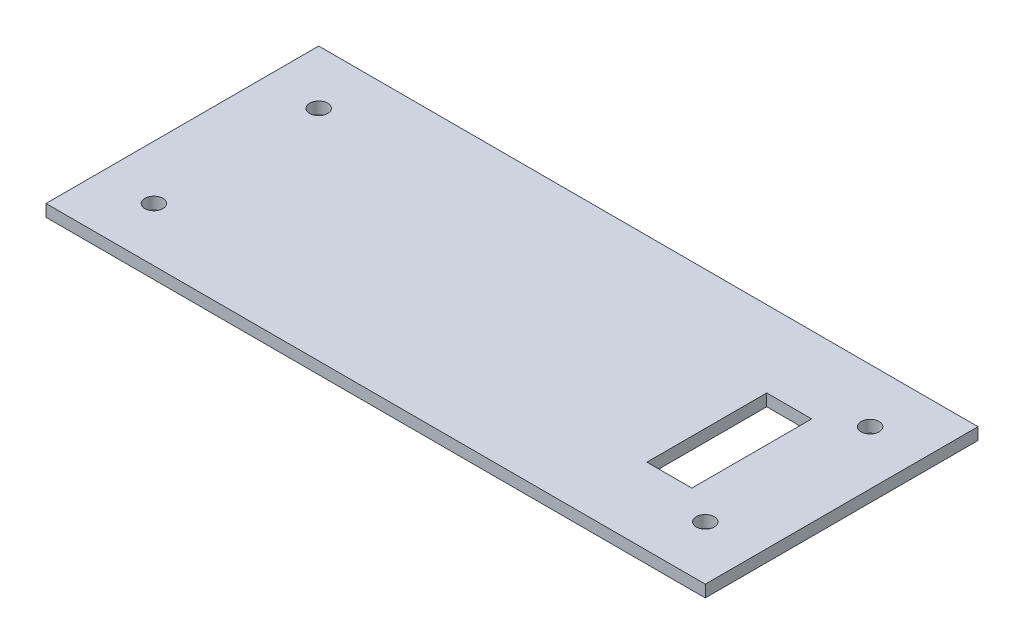
ISO-10303-21;
HEADER;
FILE_DESCRIPTION(('STEP AP214'),'2;1');
FILE_NAME('part.step','',(''),(''),'','','');
FILE_SCHEMA(('AUTOMOTIVE_DESIGN { 1 0 10303 214 1 1 1 1 }'));
ENDSEC;
DATA;
#1=APPLICATION_CONTEXT('core data for automotive mechanical design processes');
#2=APPLICATION_PROTOCOL_DEFINITION('international standard','automotive_design',2000,#1);
#3=PRODUCT_CONTEXT('',#1,'mechanical');
#4=PRODUCT('Part','Part','',(#3));
#5=PRODUCT_RELATED_PRODUCT_CATEGORY('part','',(#4));
#6=PRODUCT_DEFINITION_FORMATION('','',#4);
#7=PRODUCT_DEFINITION_CONTEXT('part definition',#1,'design');
#8=PRODUCT_DEFINITION('design','',#6,#7);
#9=PRODUCT_DEFINITION_SHAPE('','',#8);
#10=(LENGTH_UNIT() NAMED_UNIT(*) SI_UNIT(.MILLI.,.METRE.));
#11=(NAMED_UNIT(*) PLANE_ANGLE_UNIT() SI_UNIT($,.RADIAN.));
#12=(NAMED_UNIT(*) SI_UNIT($,.STERADIAN.) SOLID_ANGLE_UNIT());
#13=UNCERTAINTY_MEASURE_WITH_UNIT(LENGTH_MEASURE(1.E-05),#10,'distance_accuracy_value','');
#14=(GEOMETRIC_REPRESENTATION_CONTEXT(3) GLOBAL_UNCERTAINTY_ASSIGNED_CONTEXT((#13)) GLOBAL_UNIT_ASSIGNED_CONTEXT((#10,
#11,#12)) REPRESENTATION_CONTEXT('',''));
#15=CARTESIAN_POINT('',(0.,0.,0.));
#16=DIRECTION('',(0.,0.,1.));
#17=DIRECTION('',(1.,0.,0.));
#18=AXIS2_PLACEMENT_3D('',#15,#16,#17);
#19=CARTESIAN_POINT('',(55.,2.,-22.75));
#20=DIRECTION('',(-1.,0.,0.));
#21=DIRECTION('',(0.,0.,1.));
#22=AXIS2_PLACEMENT_3D('',#19,#20,#21);
#23=PLANE('',#22);
#24=DIRECTION('',(0.,0.,-1.));
#25=VECTOR('',#24,1.);
#26=CARTESIAN_POINT('',(55.,0.,-22.75));
#27=LINE('',#26,#25);
#28=CARTESIAN_POINT('',(55.,0.,22.75));
#29=VERTEX_POINT('',#28);
#30=CARTESIAN_POINT('',(55.,0.,-22.75));
#31=VERTEX_POINT('',#30);
#32=EDGE_CURVE('E140',#29,#31,#27,.T.);
#33=ORIENTED_EDGE('',*,*,#32,.T.);
#34=DIRECTION('',(0.,-1.,0.));
#35=VECTOR('',#34,1.);
#36=CARTESIAN_POINT('',(55.,2.,-22.75));
#37=LINE('',#36,#35);
#38=CARTESIAN_POINT('',(55.,2.,-22.75));
#39=VERTEX_POINT('',#38);
#40=EDGE_CURVE('E11',#39,#31,#37,.T.);
#41=ORIENTED_EDGE('',*,*,#40,.F.);
#42=DIRECTION('',(0.,0.,-1.));
#43=VECTOR('',#42,1.);
#44=CARTESIAN_POINT('',(55.,2.,-22.75));
#45=LINE('',#44,#43);
#46=CARTESIAN_POINT('',(55.,2.,22.75));
#47=VERTEX_POINT('',#46);
#48=EDGE_CURVE('E141',#47,#39,#45,.T.);
#49=ORIENTED_EDGE('',*,*,#48,.F.);
#50=DIRECTION('',(0.,-1.,0.));
#51=VECTOR('',#50,1.);
#52=CARTESIAN_POINT('',(55.,2.,22.75));
#53=LINE('',#52,#51);
#54=EDGE_CURVE('E151',#47,#29,#53,.T.);
#55=ORIENTED_EDGE('',*,*,#54,.T.);
#56=EDGE_LOOP('',(#33,#41,#49,#55));
#57=FACE_BOUND('',#56,.T.);
#58=ADVANCED_FACE('F32',(#57),#23,.F.);
#59=CARTESIAN_POINT('',(-55.,2.,-22.75));
#60=DIRECTION('',(0.,0.,1.));
#61=DIRECTION('',(1.,0.,0.));
#62=AXIS2_PLACEMENT_3D('',#59,#60,#61);
#63=PLANE('',#62);
#64=DIRECTION('',(-1.,0.,0.));
#65=VECTOR('',#64,1.);
#66=CARTESIAN_POINT('',(-55.,0.,-22.75));
#67=LINE('',#66,#65);
#68=CARTESIAN_POINT('',(-55.,0.,-22.75));
#69=VERTEX_POINT('',#68);
#70=EDGE_CURVE('E154',#31,#69,#67,.T.);
#71=ORIENTED_EDGE('',*,*,#70,.T.);
#72=DIRECTION('',(0.,-1.,0.));
#73=VECTOR('',#72,1.);
#74=CARTESIAN_POINT('',(-55.,2.,-22.75));
#75=LINE('',#74,#73);
#76=CARTESIAN_POINT('',(-55.,2.,-22.75));
#77=VERTEX_POINT('',#76);
#78=EDGE_CURVE('E39',#77,#69,#75,.T.);
#79=ORIENTED_EDGE('',*,*,#78,.F.);
#80=DIRECTION('',(-1.,0.,0.));
#81=VECTOR('',#80,1.);
#82=CARTESIAN_POINT('',(-55.,2.,-22.75));
#83=LINE('',#82,#81);
#84=EDGE_CURVE('E144',#39,#77,#83,.T.);
#85=ORIENTED_EDGE('',*,*,#84,.F.);
#86=ORIENTED_EDGE('',*,*,#40,.T.);
#87=EDGE_LOOP('',(#71,#79,#85,#86));
#88=FACE_BOUND('',#87,.T.);
#89=ADVANCED_FACE('F183',(#88),#63,.F.);
#90=CARTESIAN_POINT('',(-55.,2.,-22.75));
#91=DIRECTION('',(1.,0.,0.));
#92=DIRECTION('',(0.,0.,-1.));
#93=AXIS2_PLACEMENT_3D('',#90,#91,#92);
#94=PLANE('',#93);
#95=DIRECTION('',(0.,0.,1.));
#96=VECTOR('',#95,1.);
#97=CARTESIAN_POINT('',(-55.,0.,-22.75));
#98=LINE('',#97,#96);
#99=CARTESIAN_POINT('',(-55.,0.,22.75));
#100=VERTEX_POINT('',#99);
#101=EDGE_CURVE('E156',#69,#100,#98,.T.);
#102=ORIENTED_EDGE('',*,*,#101,.T.);
#103=DIRECTION('',(0.,-1.,0.));
#104=VECTOR('',#103,1.);
#105=CARTESIAN_POINT('',(-55.,2.,22.75));
#106=LINE('',#105,#104);
#107=CARTESIAN_POINT('',(-55.,2.,22.75));
#108=VERTEX_POINT('',#107);
#109=EDGE_CURVE('E161',#108,#100,#106,.T.);
#110=ORIENTED_EDGE('',*,*,#109,.F.);
#111=DIRECTION('',(0.,0.,1.));
#112=VECTOR('',#111,1.);
#113=CARTESIAN_POINT('',(-55.,2.,-22.75));
#114=LINE('',#113,#112);
#115=EDGE_CURVE('E147',#77,#108,#114,.T.);
#116=ORIENTED_EDGE('',*,*,#115,.F.);
#117=ORIENTED_EDGE('',*,*,#78,.T.);
#118=EDGE_LOOP('',(#102,#110,#116,#117));
#119=FACE_BOUND('',#118,.T.);
#120=ADVANCED_FACE('F168',(#119),#94,.F.);
#121=CARTESIAN_POINT('',(-55.,2.,22.75));
#122=DIRECTION('',(0.,0.,-1.));
#123=DIRECTION('',(-1.,0.,0.));
#124=AXIS2_PLACEMENT_3D('',#121,#122,#123);
#125=PLANE('',#124);
#126=DIRECTION('',(1.,0.,0.));
#127=VECTOR('',#126,1.);
#128=CARTESIAN_POINT('',(-55.,0.,22.75));
#129=LINE('',#128,#127);
#130=EDGE_CURVE('E145',#100,#29,#129,.T.);
#131=ORIENTED_EDGE('',*,*,#130,.T.);
#132=ORIENTED_EDGE('',*,*,#54,.F.);
#133=DIRECTION('',(1.,0.,0.));
#134=VECTOR('',#133,1.);
#135=CARTESIAN_POINT('',(-55.,2.,22.75));
#136=LINE('',#135,#134);
#137=EDGE_CURVE('E149',#108,#47,#136,.T.);
#138=ORIENTED_EDGE('',*,*,#137,.F.);
#139=ORIENTED_EDGE('',*,*,#109,.T.);
#140=EDGE_LOOP('',(#131,#132,#138,#139));
#141=FACE_BOUND('',#140,.T.);
#142=ADVANCED_FACE('F176',(#141),#125,.F.);
#143=CARTESIAN_POINT('',(0.,2.,0.));
#144=DIRECTION('',(0.,1.,0.));
#145=DIRECTION('',(0.,0.,1.));
#146=AXIS2_PLACEMENT_3D('',#143,#144,#145);
#147=PLANE('',#146);
#148=DIRECTION('',(0.,0.,-1.));
#149=VECTOR('',#148,1.);
#150=CARTESIAN_POINT('',(40.,2.,10.));
#151=LINE('',#150,#149);
#152=CARTESIAN_POINT('',(40.,2.,10.));
#153=VERTEX_POINT('',#152);
#154=CARTESIAN_POINT('',(40.,2.,-10.));
#155=VERTEX_POINT('',#154);
#156=EDGE_CURVE('E46',#153,#155,#151,.T.);
#157=ORIENTED_EDGE('',*,*,#156,.F.);
#158=DIRECTION('',(1.,0.,0.));
#159=VECTOR('',#158,1.);
#160=CARTESIAN_POINT('',(32.5,2.,10.));
#161=LINE('',#160,#159);
#162=CARTESIAN_POINT('',(32.5,2.,10.));
#163=VERTEX_POINT('',#162);
#164=EDGE_CURVE('E104',#163,#153,#161,.T.);
#165=ORIENTED_EDGE('',*,*,#164,.F.);
#166=DIRECTION('',(0.,0.,1.));
#167=VECTOR('',#166,1.);
#168=CARTESIAN_POINT('',(32.5,2.,10.));
#169=LINE('',#168,#167);
#170=CARTESIAN_POINT('',(32.5,2.,-10.));
#171=VERTEX_POINT('',#170);
#172=EDGE_CURVE('E124',#171,#163,#169,.T.);
#173=ORIENTED_EDGE('',*,*,#172,.F.);
#174=DIRECTION('',(-1.,0.,0.));
#175=VECTOR('',#174,1.);
#176=CARTESIAN_POINT('',(32.5,2.,-10.));
#177=LINE('',#176,#175);
#178=EDGE_CURVE('E118',#155,#171,#177,.T.);
#179=ORIENTED_EDGE('',*,*,#178,.F.);
#180=EDGE_LOOP('',(#157,#165,#173,#179));
#181=FACE_BOUND('',#180,.T.);
#182=CARTESIAN_POINT('',(46.,2.,13.75));
#183=DIRECTION('',(0.,1.,0.));
#184=DIRECTION('',(0.,0.,-1.));
#185=AXIS2_PLACEMENT_3D('',#182,#183,#184);
#186=CIRCLE('',#185,1.5);
#187=CARTESIAN_POINT('',(46.,2.,12.25));
#188=VERTEX_POINT('',#187);
#189=EDGE_CURVE('E110',#188,#188,#186,.T.);
#190=ORIENTED_EDGE('',*,*,#189,.F.);
#191=EDGE_LOOP('',(#190));
#192=FACE_BOUND('',#191,.T.);
#193=CARTESIAN_POINT('',(46.,2.,-13.75));
#194=DIRECTION('',(0.,1.,0.));
#195=DIRECTION('',(0.,0.,1.));
#196=AXIS2_PLACEMENT_3D('',#193,#194,#195);
#197=CIRCLE('',#196,1.5);
#198=CARTESIAN_POINT('',(46.,2.,-12.25));
#199=VERTEX_POINT('',#198);
#200=EDGE_CURVE('E237',#199,#199,#197,.T.);
#201=ORIENTED_EDGE('',*,*,#200,.F.);
#202=EDGE_LOOP('',(#201));
#203=FACE_BOUND('',#202,.T.);
#204=CARTESIAN_POINT('',(-46.,2.,-13.75));
#205=DIRECTION('',(0.,1.,0.));
#206=DIRECTION('',(0.,0.,-1.));
#207=AXIS2_PLACEMENT_3D('',#204,#205,#206);
#208=CIRCLE('',#207,1.5);
#209=CARTESIAN_POINT('',(-46.,2.,-15.25));
#210=VERTEX_POINT('',#209);
#211=EDGE_CURVE('E229',#210,#210,#208,.T.);
#212=ORIENTED_EDGE('',*,*,#211,.F.);
#213=EDGE_LOOP('',(#212));
#214=FACE_BOUND('',#213,.T.);
#215=CARTESIAN_POINT('',(-46.,2.,13.75));
#216=DIRECTION('',(0.,1.,0.));
#217=DIRECTION('',(0.,0.,1.));
#218=AXIS2_PLACEMENT_3D('',#215,#216,#217);
#219=CIRCLE('',#218,1.5);
#220=CARTESIAN_POINT('',(-46.,2.,15.25));
#221=VERTEX_POINT('',#220);
#222=EDGE_CURVE('E133',#221,#221,#219,.T.);
#223=ORIENTED_EDGE('',*,*,#222,.F.);
#224=EDGE_LOOP('',(#223));
#225=FACE_BOUND('',#224,.T.);
#226=ORIENTED_EDGE('',*,*,#48,.T.);
#227=ORIENTED_EDGE('',*,*,#84,.T.);
#228=ORIENTED_EDGE('',*,*,#115,.T.);
#229=ORIENTED_EDGE('',*,*,#137,.T.);
#230=EDGE_LOOP('',(#226,#227,#228,#229));
#231=FACE_BOUND('',#230,.T.);
#232=ADVANCED_FACE('F182',(#181,#192,#203,#214,#225,#231),#147,.T.);
#233=CARTESIAN_POINT('',(0.,0.,0.));
#234=DIRECTION('',(0.,1.,0.));
#235=DIRECTION('',(0.,0.,1.));
#236=AXIS2_PLACEMENT_3D('',#233,#234,#235);
#237=PLANE('',#236);
#238=DIRECTION('',(-1.,0.,0.));
#239=VECTOR('',#238,1.);
#240=CARTESIAN_POINT('',(32.5,0.,10.));
#241=LINE('',#240,#239);
#242=CARTESIAN_POINT('',(40.,0.,10.));
#243=VERTEX_POINT('',#242);
#244=CARTESIAN_POINT('',(32.5,0.,10.));
#245=VERTEX_POINT('',#244);
#246=EDGE_CURVE('E116',#243,#245,#241,.T.);
#247=ORIENTED_EDGE('',*,*,#246,.F.);
#248=DIRECTION('',(0.,0.,1.));
#249=VECTOR('',#248,1.);
#250=CARTESIAN_POINT('',(40.,0.,10.));
#251=LINE('',#250,#249);
#252=CARTESIAN_POINT('',(40.,0.,-10.));
#253=VERTEX_POINT('',#252);
#254=EDGE_CURVE('E98',#253,#243,#251,.T.);
#255=ORIENTED_EDGE('',*,*,#254,.F.);
#256=DIRECTION('',(1.,0.,0.));
#257=VECTOR('',#256,1.);
#258=CARTESIAN_POINT('',(32.5,0.,-10.));
#259=LINE('',#258,#257);
#260=CARTESIAN_POINT('',(32.5,0.,-10.));
#261=VERTEX_POINT('',#260);
#262=EDGE_CURVE('E107',#261,#253,#259,.T.);
#263=ORIENTED_EDGE('',*,*,#262,.F.);
#264=DIRECTION('',(0.,0.,-1.));
#265=VECTOR('',#264,1.);
#266=CARTESIAN_POINT('',(32.5,0.,10.));
#267=LINE('',#266,#265);
#268=EDGE_CURVE('E54',#245,#261,#267,.T.);
#269=ORIENTED_EDGE('',*,*,#268,.F.);
#270=EDGE_LOOP('',(#247,#255,#263,#269));
#271=FACE_BOUND('',#270,.T.);
#272=CARTESIAN_POINT('',(46.,0.,13.75));
#273=DIRECTION('',(0.,1.,0.));
#274=DIRECTION('',(0.,0.,1.));
#275=AXIS2_PLACEMENT_3D('',#272,#273,#274);
#276=CIRCLE('',#275,1.5);
#277=CARTESIAN_POINT('',(46.,0.,15.25));
#278=VERTEX_POINT('',#277);
#279=EDGE_CURVE('E240',#278,#278,#276,.F.);
#280=ORIENTED_EDGE('',*,*,#279,.F.);
#281=EDGE_LOOP('',(#280));
#282=FACE_BOUND('',#281,.T.);
#283=CARTESIAN_POINT('',(46.,0.,-13.75));
#284=DIRECTION('',(0.,1.,0.));
#285=DIRECTION('',(0.,0.,1.));
#286=AXIS2_PLACEMENT_3D('',#283,#284,#285);
#287=CIRCLE('',#286,1.5);
#288=CARTESIAN_POINT('',(46.,0.,-12.25));
#289=VERTEX_POINT('',#288);
#290=EDGE_CURVE('E234',#289,#289,#287,.F.);
#291=ORIENTED_EDGE('',*,*,#290,.F.);
#292=EDGE_LOOP('',(#291));
#293=FACE_BOUND('',#292,.T.);
#294=CARTESIAN_POINT('',(-46.,0.,-13.75));
#295=DIRECTION('',(0.,1.,0.));
#296=DIRECTION('',(0.,0.,1.));
#297=AXIS2_PLACEMENT_3D('',#294,#295,#296);
#298=CIRCLE('',#297,1.5);
#299=CARTESIAN_POINT('',(-46.,0.,-12.25));
#300=VERTEX_POINT('',#299);
#301=EDGE_CURVE('E137',#300,#300,#298,.F.);
#302=ORIENTED_EDGE('',*,*,#301,.F.);
#303=EDGE_LOOP('',(#302));
#304=FACE_BOUND('',#303,.T.);
#305=CARTESIAN_POINT('',(-46.,0.,13.75));
#306=DIRECTION('',(0.,1.,0.));
#307=DIRECTION('',(0.,0.,1.));
#308=AXIS2_PLACEMENT_3D('',#305,#306,#307);
#309=CIRCLE('',#308,1.5);
#310=CARTESIAN_POINT('',(-46.,0.,15.25));
#311=VERTEX_POINT('',#310);
#312=EDGE_CURVE('E136',#311,#311,#309,.F.);
#313=ORIENTED_EDGE('',*,*,#312,.F.);
#314=EDGE_LOOP('',(#313));
#315=FACE_BOUND('',#314,.T.);
#316=ORIENTED_EDGE('',*,*,#32,.F.);
#317=ORIENTED_EDGE('',*,*,#130,.F.);
#318=ORIENTED_EDGE('',*,*,#101,.F.);
#319=ORIENTED_EDGE('',*,*,#70,.F.);
#320=EDGE_LOOP('',(#316,#317,#318,#319));
#321=FACE_BOUND('',#320,.T.);
#322=ADVANCED_FACE('F113',(#271,#282,#293,#304,#315,#321),#237,.F.);
#323=CARTESIAN_POINT('',(-46.,-0.00100000000000013,13.75));
#324=DIRECTION('',(0.,1.,0.));
#325=DIRECTION('',(0.,0.,1.));
#326=AXIS2_PLACEMENT_3D('',#323,#324,#325);
#327=CYLINDRICAL_SURFACE('',#326,1.5);
#328=ORIENTED_EDGE('',*,*,#222,.T.);
#329=EDGE_LOOP('',(#328));
#330=FACE_BOUND('',#329,.T.);
#331=ORIENTED_EDGE('',*,*,#312,.T.);
#332=EDGE_LOOP('',(#331));
#333=FACE_BOUND('',#332,.T.);
#334=ADVANCED_FACE('F195',(#330,#333),#327,.F.);
#335=CARTESIAN_POINT('',(-46.,-0.00100000000000013,-13.75));
#336=DIRECTION('',(0.,1.,0.));
#337=DIRECTION('',(0.,0.,1.));
#338=AXIS2_PLACEMENT_3D('',#335,#336,#337);
#339=CYLINDRICAL_SURFACE('',#338,1.5);
#340=ORIENTED_EDGE('',*,*,#211,.T.);
#341=EDGE_LOOP('',(#340));
#342=FACE_BOUND('',#341,.T.);
#343=ORIENTED_EDGE('',*,*,#301,.T.);
#344=EDGE_LOOP('',(#343));
#345=FACE_BOUND('',#344,.T.);
#346=ADVANCED_FACE('F201',(#342,#345),#339,.F.);
#347=CARTESIAN_POINT('',(46.,-0.00100000000000013,-13.75));
#348=DIRECTION('',(0.,1.,0.));
#349=DIRECTION('',(0.,0.,1.));
#350=AXIS2_PLACEMENT_3D('',#347,#348,#349);
#351=CYLINDRICAL_SURFACE('',#350,1.5);
#352=ORIENTED_EDGE('',*,*,#200,.T.);
#353=EDGE_LOOP('',(#352));
#354=FACE_BOUND('',#353,.T.);
#355=ORIENTED_EDGE('',*,*,#290,.T.);
#356=EDGE_LOOP('',(#355));
#357=FACE_BOUND('',#356,.T.);
#358=ADVANCED_FACE('F217',(#354,#357),#351,.F.);
#359=CARTESIAN_POINT('',(46.,-0.00100000000000013,13.75));
#360=DIRECTION('',(0.,1.,0.));
#361=DIRECTION('',(0.,0.,1.));
#362=AXIS2_PLACEMENT_3D('',#359,#360,#361);
#363=CYLINDRICAL_SURFACE('',#362,1.5);
#364=ORIENTED_EDGE('',*,*,#189,.T.);
#365=EDGE_LOOP('',(#364));
#366=FACE_BOUND('',#365,.T.);
#367=ORIENTED_EDGE('',*,*,#279,.T.);
#368=EDGE_LOOP('',(#367));
#369=FACE_BOUND('',#368,.T.);
#370=ADVANCED_FACE('F206',(#366,#369),#363,.F.);
#371=CARTESIAN_POINT('',(40.,-0.00100000000000013,10.));
#372=DIRECTION('',(1.,0.,0.));
#373=DIRECTION('',(0.,0.,-1.));
#374=AXIS2_PLACEMENT_3D('',#371,#372,#373);
#375=PLANE('',#374);
#376=ORIENTED_EDGE('',*,*,#254,.T.);
#377=DIRECTION('',(0.,1.,0.));
#378=VECTOR('',#377,1.);
#379=CARTESIAN_POINT('',(40.,-0.00100000000000013,10.));
#380=LINE('',#379,#378);
#381=EDGE_CURVE('E111',#243,#153,#380,.T.);
#382=ORIENTED_EDGE('',*,*,#381,.T.);
#383=ORIENTED_EDGE('',*,*,#156,.T.);
#384=DIRECTION('',(0.,1.,0.));
#385=VECTOR('',#384,1.);
#386=CARTESIAN_POINT('',(40.,-0.00100000000000013,-10.));
#387=LINE('',#386,#385);
#388=EDGE_CURVE('E94',#253,#155,#387,.T.);
#389=ORIENTED_EDGE('',*,*,#388,.F.);
#390=EDGE_LOOP('',(#376,#382,#383,#389));
#391=FACE_BOUND('',#390,.T.);
#392=ADVANCED_FACE('F96',(#391),#375,.F.);
#393=CARTESIAN_POINT('',(32.5,-0.00100000000000013,10.));
#394=DIRECTION('',(0.,0.,1.));
#395=DIRECTION('',(1.,0.,0.));
#396=AXIS2_PLACEMENT_3D('',#393,#394,#395);
#397=PLANE('',#396);
#398=ORIENTED_EDGE('',*,*,#246,.T.);
#399=DIRECTION('',(0.,1.,0.));
#400=VECTOR('',#399,1.);
#401=CARTESIAN_POINT('',(32.5,-0.00100000000000013,10.));
#402=LINE('',#401,#400);
#403=EDGE_CURVE('E130',#245,#163,#402,.T.);
#404=ORIENTED_EDGE('',*,*,#403,.T.);
#405=ORIENTED_EDGE('',*,*,#164,.T.);
#406=ORIENTED_EDGE('',*,*,#381,.F.);
#407=EDGE_LOOP('',(#398,#404,#405,#406));
#408=FACE_BOUND('',#407,.T.);
#409=ADVANCED_FACE('F205',(#408),#397,.F.);
#410=CARTESIAN_POINT('',(32.5,-0.00100000000000013,10.));
#411=DIRECTION('',(-1.,0.,0.));
#412=DIRECTION('',(0.,0.,1.));
#413=AXIS2_PLACEMENT_3D('',#410,#411,#412);
#414=PLANE('',#413);
#415=ORIENTED_EDGE('',*,*,#268,.T.);
#416=DIRECTION('',(0.,1.,0.));
#417=VECTOR('',#416,1.);
#418=CARTESIAN_POINT('',(32.5,-0.00100000000000013,-10.));
#419=LINE('',#418,#417);
#420=EDGE_CURVE('E103',#261,#171,#419,.T.);
#421=ORIENTED_EDGE('',*,*,#420,.T.);
#422=ORIENTED_EDGE('',*,*,#172,.T.);
#423=ORIENTED_EDGE('',*,*,#403,.F.);
#424=EDGE_LOOP('',(#415,#421,#422,#423));
#425=FACE_BOUND('',#424,.T.);
#426=ADVANCED_FACE('F209',(#425),#414,.F.);
#427=CARTESIAN_POINT('',(32.5,-0.00100000000000013,-10.));
#428=DIRECTION('',(0.,0.,-1.));
#429=DIRECTION('',(-1.,0.,0.));
#430=AXIS2_PLACEMENT_3D('',#427,#428,#429);
#431=PLANE('',#430);
#432=ORIENTED_EDGE('',*,*,#262,.T.);
#433=ORIENTED_EDGE('',*,*,#388,.T.);
#434=ORIENTED_EDGE('',*,*,#178,.T.);
#435=ORIENTED_EDGE('',*,*,#420,.F.);
#436=EDGE_LOOP('',(#432,#433,#434,#435));
#437=FACE_BOUND('',#436,.T.);
#438=ADVANCED_FACE('F108',(#437),#431,.F.);
#439=CLOSED_SHELL('',(#58,#89,#120,#142,#232,#322,#334,#346,#358,#370,#392,#409,#426,#438));
#440=MANIFOLD_SOLID_BREP('B2',#439);
#441=ADVANCED_BREP_SHAPE_REPRESENTATION('',(#18,#440),#14);
#442=SHAPE_DEFINITION_REPRESENTATION(#9,#441);
ENDSEC;
END-ISO-10303-21;
